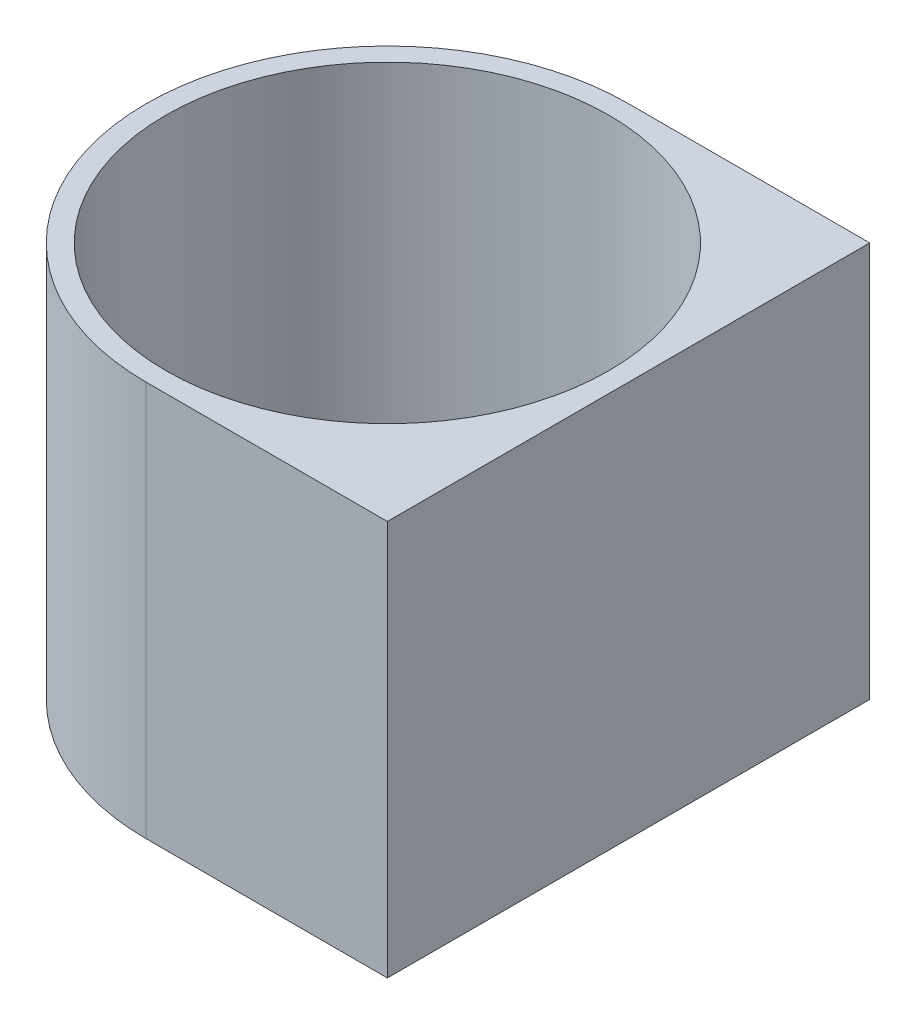
ISO-10303-21;
HEADER;
FILE_DESCRIPTION(('STEP AP214'),'2;1');
FILE_NAME('part.step','',(''),(''),'','','');
FILE_SCHEMA(('AUTOMOTIVE_DESIGN { 1 0 10303 214 1 1 1 1 }'));
ENDSEC;
DATA;
#1=APPLICATION_CONTEXT('core data for automotive mechanical design processes');
#2=APPLICATION_PROTOCOL_DEFINITION('international standard','automotive_design',2000,#1);
#3=PRODUCT_CONTEXT('',#1,'mechanical');
#4=PRODUCT('Part','Part','',(#3));
#5=PRODUCT_RELATED_PRODUCT_CATEGORY('part','',(#4));
#6=PRODUCT_DEFINITION_FORMATION('','',#4);
#7=PRODUCT_DEFINITION_CONTEXT('part definition',#1,'design');
#8=PRODUCT_DEFINITION('design','',#6,#7);
#9=PRODUCT_DEFINITION_SHAPE('','',#8);
#10=(LENGTH_UNIT() NAMED_UNIT(*) SI_UNIT(.MILLI.,.METRE.));
#11=(NAMED_UNIT(*) PLANE_ANGLE_UNIT() SI_UNIT($,.RADIAN.));
#12=(NAMED_UNIT(*) SI_UNIT($,.STERADIAN.) SOLID_ANGLE_UNIT());
#13=UNCERTAINTY_MEASURE_WITH_UNIT(LENGTH_MEASURE(1.E-05),#10,'distance_accuracy_value','');
#14=(GEOMETRIC_REPRESENTATION_CONTEXT(3) GLOBAL_UNCERTAINTY_ASSIGNED_CONTEXT((#13)) GLOBAL_UNIT_ASSIGNED_CONTEXT((#10,
#11,#12)) REPRESENTATION_CONTEXT('',''));
#15=CARTESIAN_POINT('',(0.,0.,0.));
#16=DIRECTION('',(0.,0.,1.));
#17=DIRECTION('',(1.,0.,0.));
#18=AXIS2_PLACEMENT_3D('',#15,#16,#17);
#19=CARTESIAN_POINT('',(0.,63.5,0.));
#20=DIRECTION('',(0.,1.,0.));
#21=DIRECTION('',(0.,0.,1.));
#22=AXIS2_PLACEMENT_3D('',#19,#20,#21);
#23=PLANE('',#22);
#24=DIRECTION('',(0.,0.,1.));
#25=VECTOR('',#24,1.);
#26=CARTESIAN_POINT('',(38.735,63.5,38.735));
#27=LINE('',#26,#25);
#28=CARTESIAN_POINT('',(38.735,63.5,-38.735));
#29=VERTEX_POINT('',#28);
#30=CARTESIAN_POINT('',(38.735,63.5,38.735));
#31=VERTEX_POINT('',#30);
#32=EDGE_CURVE('E95',#29,#31,#27,.T.);
#33=ORIENTED_EDGE('',*,*,#32,.F.);
#34=DIRECTION('',(1.,0.,0.));
#35=VECTOR('',#34,1.);
#36=CARTESIAN_POINT('',(-38.736,63.5,-38.735));
#37=LINE('',#36,#35);
#38=CARTESIAN_POINT('',(0.,63.5,-38.735));
#39=VERTEX_POINT('',#38);
#40=EDGE_CURVE('E80',#39,#29,#37,.T.);
#41=ORIENTED_EDGE('',*,*,#40,.F.);
#42=CARTESIAN_POINT('',(0.,63.5,0.));
#43=DIRECTION('',(0.,1.,0.));
#44=DIRECTION('',(0.,0.,1.));
#45=AXIS2_PLACEMENT_3D('',#42,#43,#44);
#46=CIRCLE('',#45,38.735);
#47=CARTESIAN_POINT('',(0.,63.5,38.735));
#48=VERTEX_POINT('',#47);
#49=EDGE_CURVE('E11',#39,#48,#46,.T.);
#50=ORIENTED_EDGE('',*,*,#49,.T.);
#51=DIRECTION('',(1.,0.,0.));
#52=VECTOR('',#51,1.);
#53=CARTESIAN_POINT('',(-38.736,63.5,38.735));
#54=LINE('',#53,#52);
#55=EDGE_CURVE('E69',#48,#31,#54,.T.);
#56=ORIENTED_EDGE('',*,*,#55,.T.);
#57=EDGE_LOOP('',(#33,#41,#50,#56));
#58=FACE_BOUND('',#57,.T.);
#59=CARTESIAN_POINT('',(0.,63.5,0.));
#60=DIRECTION('',(0.,1.,0.));
#61=DIRECTION('',(0.,0.,1.));
#62=AXIS2_PLACEMENT_3D('',#59,#60,#61);
#63=CIRCLE('',#62,35.56);
#64=CARTESIAN_POINT('',(0.,63.5,35.56));
#65=VERTEX_POINT('',#64);
#66=EDGE_CURVE('E114',#65,#65,#63,.T.);
#67=ORIENTED_EDGE('',*,*,#66,.F.);
#68=EDGE_LOOP('',(#67));
#69=FACE_BOUND('',#68,.T.);
#70=ADVANCED_FACE('F39',(#58,#69),#23,.T.);
#71=CARTESIAN_POINT('',(0.,0.,0.));
#72=DIRECTION('',(0.,1.,0.));
#73=DIRECTION('',(0.,0.,1.));
#74=AXIS2_PLACEMENT_3D('',#71,#72,#73);
#75=PLANE('',#74);
#76=CARTESIAN_POINT('',(0.,0.,0.));
#77=DIRECTION('',(0.,1.,0.));
#78=DIRECTION('',(0.,0.,1.));
#79=AXIS2_PLACEMENT_3D('',#76,#77,#78);
#80=CIRCLE('',#79,38.735);
#81=CARTESIAN_POINT('',(0.,0.,-38.735));
#82=VERTEX_POINT('',#81);
#83=CARTESIAN_POINT('',(0.,0.,38.735));
#84=VERTEX_POINT('',#83);
#85=EDGE_CURVE('E43',#82,#84,#80,.T.);
#86=ORIENTED_EDGE('',*,*,#85,.F.);
#87=DIRECTION('',(1.,0.,0.));
#88=VECTOR('',#87,1.);
#89=CARTESIAN_POINT('',(-38.736,0.,-38.735));
#90=LINE('',#89,#88);
#91=CARTESIAN_POINT('',(38.735,0.,-38.735));
#92=VERTEX_POINT('',#91);
#93=EDGE_CURVE('E77',#82,#92,#90,.T.);
#94=ORIENTED_EDGE('',*,*,#93,.T.);
#95=DIRECTION('',(0.,0.,-1.));
#96=VECTOR('',#95,1.);
#97=CARTESIAN_POINT('',(38.735,0.,38.735));
#98=LINE('',#97,#96);
#99=CARTESIAN_POINT('',(38.735,0.,38.735));
#100=VERTEX_POINT('',#99);
#101=EDGE_CURVE('E89',#100,#92,#98,.T.);
#102=ORIENTED_EDGE('',*,*,#101,.F.);
#103=DIRECTION('',(1.,0.,0.));
#104=VECTOR('',#103,1.);
#105=CARTESIAN_POINT('',(-38.736,0.,38.735));
#106=LINE('',#105,#104);
#107=EDGE_CURVE('E111',#84,#100,#106,.T.);
#108=ORIENTED_EDGE('',*,*,#107,.F.);
#109=EDGE_LOOP('',(#86,#94,#102,#108));
#110=FACE_BOUND('',#109,.T.);
#111=CARTESIAN_POINT('',(0.,0.,0.));
#112=DIRECTION('',(0.,1.,0.));
#113=DIRECTION('',(0.,0.,1.));
#114=AXIS2_PLACEMENT_3D('',#111,#112,#113);
#115=CIRCLE('',#114,35.56);
#116=CARTESIAN_POINT('',(0.,0.,35.56));
#117=VERTEX_POINT('',#116);
#118=EDGE_CURVE('E110',#117,#117,#115,.T.);
#119=ORIENTED_EDGE('',*,*,#118,.T.);
#120=EDGE_LOOP('',(#119));
#121=FACE_BOUND('',#120,.T.);
#122=ADVANCED_FACE('F97',(#110,#121),#75,.F.);
#123=CARTESIAN_POINT('',(0.,63.5,0.));
#124=DIRECTION('',(0.,-1.,0.));
#125=DIRECTION('',(0.,0.,-1.));
#126=AXIS2_PLACEMENT_3D('',#123,#124,#125);
#127=CYLINDRICAL_SURFACE('',#126,38.735);
#128=ORIENTED_EDGE('',*,*,#49,.F.);
#129=DIRECTION('',(0.,-1.,0.));
#130=VECTOR('',#129,1.);
#131=CARTESIAN_POINT('',(0.,63.5,-38.735));
#132=LINE('',#131,#130);
#133=EDGE_CURVE('E99',#82,#39,#132,.F.);
#134=ORIENTED_EDGE('',*,*,#133,.F.);
#135=ORIENTED_EDGE('',*,*,#85,.T.);
#136=DIRECTION('',(0.,-1.,0.));
#137=VECTOR('',#136,1.);
#138=CARTESIAN_POINT('',(0.,63.5,38.735));
#139=LINE('',#138,#137);
#140=EDGE_CURVE('E108',#84,#48,#139,.F.);
#141=ORIENTED_EDGE('',*,*,#140,.T.);
#142=EDGE_LOOP('',(#128,#134,#135,#141));
#143=FACE_BOUND('',#142,.T.);
#144=ADVANCED_FACE('F41',(#143),#127,.T.);
#145=CARTESIAN_POINT('',(0.,63.5,0.));
#146=DIRECTION('',(0.,-1.,0.));
#147=DIRECTION('',(0.,0.,-1.));
#148=AXIS2_PLACEMENT_3D('',#145,#146,#147);
#149=CYLINDRICAL_SURFACE('',#148,35.56);
#150=ORIENTED_EDGE('',*,*,#66,.T.);
#151=EDGE_LOOP('',(#150));
#152=FACE_BOUND('',#151,.T.);
#153=ORIENTED_EDGE('',*,*,#118,.F.);
#154=EDGE_LOOP('',(#153));
#155=FACE_BOUND('',#154,.T.);
#156=ADVANCED_FACE('F120',(#152,#155),#149,.F.);
#157=CARTESIAN_POINT('',(38.735,0.,0.));
#158=DIRECTION('',(1.,0.,0.));
#159=DIRECTION('',(0.,0.,-1.));
#160=AXIS2_PLACEMENT_3D('',#157,#158,#159);
#161=PLANE('',#160);
#162=ORIENTED_EDGE('',*,*,#101,.T.);
#163=DIRECTION('',(0.,1.,0.));
#164=VECTOR('',#163,1.);
#165=CARTESIAN_POINT('',(38.735,63.5,-38.735));
#166=LINE('',#165,#164);
#167=EDGE_CURVE('E91',#92,#29,#166,.T.);
#168=ORIENTED_EDGE('',*,*,#167,.T.);
#169=ORIENTED_EDGE('',*,*,#32,.T.);
#170=DIRECTION('',(0.,-1.,0.));
#171=VECTOR('',#170,1.);
#172=CARTESIAN_POINT('',(38.735,63.5,38.735));
#173=LINE('',#172,#171);
#174=EDGE_CURVE('E93',#31,#100,#173,.T.);
#175=ORIENTED_EDGE('',*,*,#174,.T.);
#176=EDGE_LOOP('',(#162,#168,#169,#175));
#177=FACE_BOUND('',#176,.T.);
#178=ADVANCED_FACE('F90',(#177),#161,.T.);
#179=CARTESIAN_POINT('',(-38.736,63.5,38.735));
#180=DIRECTION('',(0.,0.,1.));
#181=DIRECTION('',(1.,0.,0.));
#182=AXIS2_PLACEMENT_3D('',#179,#180,#181);
#183=PLANE('',#182);
#184=ORIENTED_EDGE('',*,*,#140,.F.);
#185=ORIENTED_EDGE('',*,*,#107,.T.);
#186=ORIENTED_EDGE('',*,*,#174,.F.);
#187=ORIENTED_EDGE('',*,*,#55,.F.);
#188=EDGE_LOOP('',(#184,#185,#186,#187));
#189=FACE_BOUND('',#188,.T.);
#190=ADVANCED_FACE('F124',(#189),#183,.T.);
#191=CARTESIAN_POINT('',(-38.736,63.5,-38.735));
#192=DIRECTION('',(0.,0.,-1.));
#193=DIRECTION('',(-1.,0.,0.));
#194=AXIS2_PLACEMENT_3D('',#191,#192,#193);
#195=PLANE('',#194);
#196=ORIENTED_EDGE('',*,*,#93,.F.);
#197=ORIENTED_EDGE('',*,*,#133,.T.);
#198=ORIENTED_EDGE('',*,*,#40,.T.);
#199=ORIENTED_EDGE('',*,*,#167,.F.);
#200=EDGE_LOOP('',(#196,#197,#198,#199));
#201=FACE_BOUND('',#200,.T.);
#202=ADVANCED_FACE('F101',(#201),#195,.T.);
#203=CLOSED_SHELL('',(#70,#122,#144,#156,#178,#190,#202));
#204=MANIFOLD_SOLID_BREP('B2',#203);
#205=ADVANCED_BREP_SHAPE_REPRESENTATION('',(#18,#204),#14);
#206=SHAPE_DEFINITION_REPRESENTATION(#9,#205);
ENDSEC;
END-ISO-10303-21;
